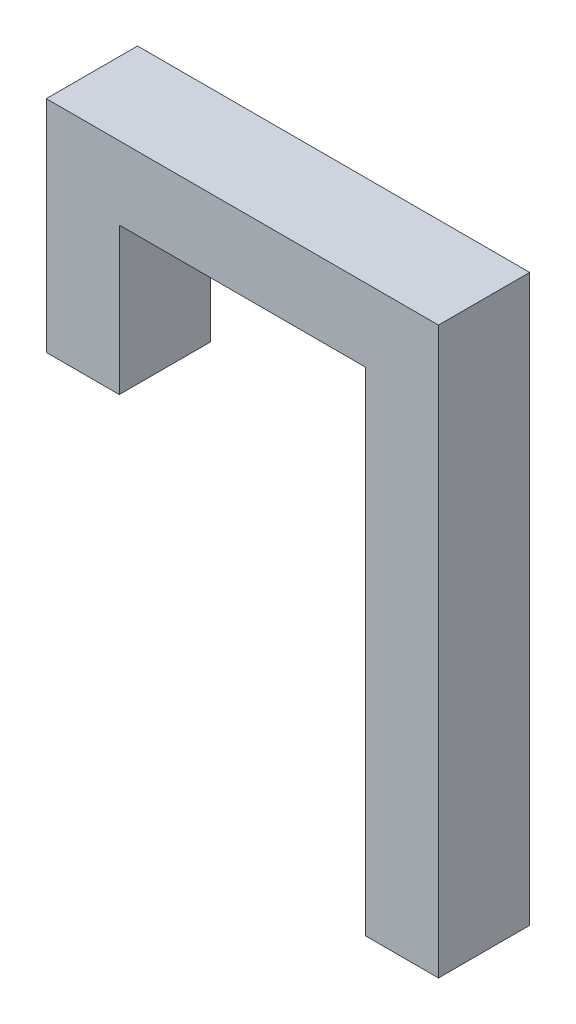
ISO-10303-21;
HEADER;
FILE_DESCRIPTION(('STEP AP214'),'2;1');
FILE_NAME('part.step','',(''),(''),'','','');
FILE_SCHEMA(('AUTOMOTIVE_DESIGN { 1 0 10303 214 1 1 1 1 }'));
ENDSEC;
DATA;
#1=APPLICATION_CONTEXT('core data for automotive mechanical design processes');
#2=APPLICATION_PROTOCOL_DEFINITION('international standard','automotive_design',2000,#1);
#3=PRODUCT_CONTEXT('',#1,'mechanical');
#4=PRODUCT('Part','Part','',(#3));
#5=PRODUCT_RELATED_PRODUCT_CATEGORY('part','',(#4));
#6=PRODUCT_DEFINITION_FORMATION('','',#4);
#7=PRODUCT_DEFINITION_CONTEXT('part definition',#1,'design');
#8=PRODUCT_DEFINITION('design','',#6,#7);
#9=PRODUCT_DEFINITION_SHAPE('','',#8);
#10=(LENGTH_UNIT() NAMED_UNIT(*) SI_UNIT(.MILLI.,.METRE.));
#11=(NAMED_UNIT(*) PLANE_ANGLE_UNIT() SI_UNIT($,.RADIAN.));
#12=(NAMED_UNIT(*) SI_UNIT($,.STERADIAN.) SOLID_ANGLE_UNIT());
#13=UNCERTAINTY_MEASURE_WITH_UNIT(LENGTH_MEASURE(1.E-05),#10,'distance_accuracy_value','');
#14=(GEOMETRIC_REPRESENTATION_CONTEXT(3) GLOBAL_UNCERTAINTY_ASSIGNED_CONTEXT((#13)) GLOBAL_UNIT_ASSIGNED_CONTEXT((#10,
#11,#12)) REPRESENTATION_CONTEXT('',''));
#15=CARTESIAN_POINT('',(0.,0.,0.));
#16=DIRECTION('',(0.,0.,1.));
#17=DIRECTION('',(1.,0.,0.));
#18=AXIS2_PLACEMENT_3D('',#15,#16,#17);
#19=CARTESIAN_POINT('',(0.,0.,5.));
#20=DIRECTION('',(-1.,0.,0.));
#21=DIRECTION('',(0.,0.,1.));
#22=AXIS2_PLACEMENT_3D('',#19,#20,#21);
#23=PLANE('',#22);
#24=DIRECTION('',(0.,1.,0.));
#25=VECTOR('',#24,1.);
#26=CARTESIAN_POINT('',(0.,0.,0.));
#27=LINE('',#26,#25);
#28=CARTESIAN_POINT('',(0.,-8.05,0.));
#29=VERTEX_POINT('',#28);
#30=CARTESIAN_POINT('',(0.,0.,0.));
#31=VERTEX_POINT('',#30);
#32=EDGE_CURVE('E129',#29,#31,#27,.T.);
#33=ORIENTED_EDGE('',*,*,#32,.T.);
#34=DIRECTION('',(0.,0.,-1.));
#35=VECTOR('',#34,1.);
#36=CARTESIAN_POINT('',(0.,0.,5.));
#37=LINE('',#36,#35);
#38=CARTESIAN_POINT('',(0.,0.,5.));
#39=VERTEX_POINT('',#38);
#40=EDGE_CURVE('E11',#39,#31,#37,.T.);
#41=ORIENTED_EDGE('',*,*,#40,.F.);
#42=DIRECTION('',(0.,1.,0.));
#43=VECTOR('',#42,1.);
#44=CARTESIAN_POINT('',(0.,0.,5.));
#45=LINE('',#44,#43);
#46=CARTESIAN_POINT('',(0.,-8.05,5.));
#47=VERTEX_POINT('',#46);
#48=EDGE_CURVE('E143',#47,#39,#45,.T.);
#49=ORIENTED_EDGE('',*,*,#48,.F.);
#50=DIRECTION('',(0.,0.,-1.));
#51=VECTOR('',#50,1.);
#52=CARTESIAN_POINT('',(0.,-8.05,5.));
#53=LINE('',#52,#51);
#54=EDGE_CURVE('E125',#47,#29,#53,.T.);
#55=ORIENTED_EDGE('',*,*,#54,.T.);
#56=EDGE_LOOP('',(#33,#41,#49,#55));
#57=FACE_BOUND('',#56,.T.);
#58=ADVANCED_FACE('F33',(#57),#23,.F.);
#59=CARTESIAN_POINT('',(0.,0.,5.));
#60=DIRECTION('',(0.,1.,0.));
#61=DIRECTION('',(0.,0.,1.));
#62=AXIS2_PLACEMENT_3D('',#59,#60,#61);
#63=PLANE('',#62);
#64=DIRECTION('',(1.,0.,0.));
#65=VECTOR('',#64,1.);
#66=CARTESIAN_POINT('',(0.,0.,0.));
#67=LINE('',#66,#65);
#68=CARTESIAN_POINT('',(13.5,0.,0.));
#69=VERTEX_POINT('',#68);
#70=EDGE_CURVE('E132',#31,#69,#67,.T.);
#71=ORIENTED_EDGE('',*,*,#70,.T.);
#72=DIRECTION('',(0.,0.,-1.));
#73=VECTOR('',#72,1.);
#74=CARTESIAN_POINT('',(13.5,0.,5.));
#75=LINE('',#74,#73);
#76=CARTESIAN_POINT('',(13.5,0.,5.));
#77=VERTEX_POINT('',#76);
#78=EDGE_CURVE('E41',#77,#69,#75,.T.);
#79=ORIENTED_EDGE('',*,*,#78,.F.);
#80=DIRECTION('',(1.,0.,0.));
#81=VECTOR('',#80,1.);
#82=CARTESIAN_POINT('',(0.,0.,5.));
#83=LINE('',#82,#81);
#84=EDGE_CURVE('E92',#39,#77,#83,.T.);
#85=ORIENTED_EDGE('',*,*,#84,.F.);
#86=ORIENTED_EDGE('',*,*,#40,.T.);
#87=EDGE_LOOP('',(#71,#79,#85,#86));
#88=FACE_BOUND('',#87,.T.);
#89=ADVANCED_FACE('F178',(#88),#63,.F.);
#90=CARTESIAN_POINT('',(13.5,0.,5.));
#91=DIRECTION('',(1.,0.,0.));
#92=DIRECTION('',(0.,1.,0.));
#93=AXIS2_PLACEMENT_3D('',#90,#91,#92);
#94=PLANE('',#93);
#95=DIRECTION('',(0.,-1.,0.));
#96=VECTOR('',#95,1.);
#97=CARTESIAN_POINT('',(13.5,0.,0.));
#98=LINE('',#97,#96);
#99=CARTESIAN_POINT('',(13.5,-27.,0.));
#100=VERTEX_POINT('',#99);
#101=EDGE_CURVE('E134',#69,#100,#98,.T.);
#102=ORIENTED_EDGE('',*,*,#101,.T.);
#103=DIRECTION('',(0.,0.,-1.));
#104=VECTOR('',#103,1.);
#105=CARTESIAN_POINT('',(13.5,-27.,5.));
#106=LINE('',#105,#104);
#107=CARTESIAN_POINT('',(13.5,-27.,5.));
#108=VERTEX_POINT('',#107);
#109=EDGE_CURVE('E150',#108,#100,#106,.T.);
#110=ORIENTED_EDGE('',*,*,#109,.F.);
#111=DIRECTION('',(0.,-1.,0.));
#112=VECTOR('',#111,1.);
#113=CARTESIAN_POINT('',(13.5,0.,5.));
#114=LINE('',#113,#112);
#115=EDGE_CURVE('E158',#77,#108,#114,.T.);
#116=ORIENTED_EDGE('',*,*,#115,.F.);
#117=ORIENTED_EDGE('',*,*,#78,.T.);
#118=EDGE_LOOP('',(#102,#110,#116,#117));
#119=FACE_BOUND('',#118,.T.);
#120=ADVANCED_FACE('F156',(#119),#94,.F.);
#121=CARTESIAN_POINT('',(17.5,-27.,5.));
#122=DIRECTION('',(0.,1.,0.));
#123=DIRECTION('',(-1.,0.,0.));
#124=AXIS2_PLACEMENT_3D('',#121,#122,#123);
#125=PLANE('',#124);
#126=DIRECTION('',(1.,0.,0.));
#127=VECTOR('',#126,1.);
#128=CARTESIAN_POINT('',(17.5,-27.,0.));
#129=LINE('',#128,#127);
#130=CARTESIAN_POINT('',(17.5,-27.,0.));
#131=VERTEX_POINT('',#130);
#132=EDGE_CURVE('E136',#100,#131,#129,.T.);
#133=ORIENTED_EDGE('',*,*,#132,.T.);
#134=DIRECTION('',(0.,0.,-1.));
#135=VECTOR('',#134,1.);
#136=CARTESIAN_POINT('',(17.5,-27.,5.));
#137=LINE('',#136,#135);
#138=CARTESIAN_POINT('',(17.5,-27.,5.));
#139=VERTEX_POINT('',#138);
#140=EDGE_CURVE('E147',#139,#131,#137,.T.);
#141=ORIENTED_EDGE('',*,*,#140,.F.);
#142=DIRECTION('',(1.,0.,0.));
#143=VECTOR('',#142,1.);
#144=CARTESIAN_POINT('',(17.5,-27.,5.));
#145=LINE('',#144,#143);
#146=EDGE_CURVE('E170',#108,#139,#145,.T.);
#147=ORIENTED_EDGE('',*,*,#146,.F.);
#148=ORIENTED_EDGE('',*,*,#109,.T.);
#149=EDGE_LOOP('',(#133,#141,#147,#148));
#150=FACE_BOUND('',#149,.T.);
#151=ADVANCED_FACE('F166',(#150),#125,.F.);
#152=CARTESIAN_POINT('',(17.5,4.,5.));
#153=DIRECTION('',(-1.,0.,0.));
#154=DIRECTION('',(0.,-1.,0.));
#155=AXIS2_PLACEMENT_3D('',#152,#153,#154);
#156=PLANE('',#155);
#157=DIRECTION('',(0.,1.,0.));
#158=VECTOR('',#157,1.);
#159=CARTESIAN_POINT('',(17.5,4.,0.));
#160=LINE('',#159,#158);
#161=CARTESIAN_POINT('',(17.5,4.,0.));
#162=VERTEX_POINT('',#161);
#163=EDGE_CURVE('E138',#131,#162,#160,.T.);
#164=ORIENTED_EDGE('',*,*,#163,.T.);
#165=DIRECTION('',(0.,0.,-1.));
#166=VECTOR('',#165,1.);
#167=CARTESIAN_POINT('',(17.5,4.,5.));
#168=LINE('',#167,#166);
#169=CARTESIAN_POINT('',(17.5,4.,5.));
#170=VERTEX_POINT('',#169);
#171=EDGE_CURVE('E120',#170,#162,#168,.T.);
#172=ORIENTED_EDGE('',*,*,#171,.F.);
#173=DIRECTION('',(0.,1.,0.));
#174=VECTOR('',#173,1.);
#175=CARTESIAN_POINT('',(17.5,4.,5.));
#176=LINE('',#175,#174);
#177=EDGE_CURVE('E111',#139,#170,#176,.T.);
#178=ORIENTED_EDGE('',*,*,#177,.F.);
#179=ORIENTED_EDGE('',*,*,#140,.T.);
#180=EDGE_LOOP('',(#164,#172,#178,#179));
#181=FACE_BOUND('',#180,.T.);
#182=ADVANCED_FACE('F169',(#181),#156,.F.);
#183=CARTESIAN_POINT('',(-4.,4.,5.));
#184=DIRECTION('',(0.,-1.,0.));
#185=DIRECTION('',(0.,0.,-1.));
#186=AXIS2_PLACEMENT_3D('',#183,#184,#185);
#187=PLANE('',#186);
#188=DIRECTION('',(-1.,0.,0.));
#189=VECTOR('',#188,1.);
#190=CARTESIAN_POINT('',(-4.,4.,0.));
#191=LINE('',#190,#189);
#192=CARTESIAN_POINT('',(-4.,4.,0.));
#193=VERTEX_POINT('',#192);
#194=EDGE_CURVE('E119',#162,#193,#191,.T.);
#195=ORIENTED_EDGE('',*,*,#194,.T.);
#196=DIRECTION('',(0.,0.,-1.));
#197=VECTOR('',#196,1.);
#198=CARTESIAN_POINT('',(-4.,4.,5.));
#199=LINE('',#198,#197);
#200=CARTESIAN_POINT('',(-4.,4.,5.));
#201=VERTEX_POINT('',#200);
#202=EDGE_CURVE('E116',#201,#193,#199,.T.);
#203=ORIENTED_EDGE('',*,*,#202,.F.);
#204=DIRECTION('',(-1.,0.,0.));
#205=VECTOR('',#204,1.);
#206=CARTESIAN_POINT('',(-4.,4.,5.));
#207=LINE('',#206,#205);
#208=EDGE_CURVE('E105',#170,#201,#207,.T.);
#209=ORIENTED_EDGE('',*,*,#208,.F.);
#210=ORIENTED_EDGE('',*,*,#171,.T.);
#211=EDGE_LOOP('',(#195,#203,#209,#210));
#212=FACE_BOUND('',#211,.T.);
#213=ADVANCED_FACE('F117',(#212),#187,.F.);
#214=CARTESIAN_POINT('',(-4.,-8.05,5.));
#215=DIRECTION('',(1.,0.,0.));
#216=DIRECTION('',(0.,0.,-1.));
#217=AXIS2_PLACEMENT_3D('',#214,#215,#216);
#218=PLANE('',#217);
#219=DIRECTION('',(0.,-1.,0.));
#220=VECTOR('',#219,1.);
#221=CARTESIAN_POINT('',(-4.,-8.05,0.));
#222=LINE('',#221,#220);
#223=CARTESIAN_POINT('',(-4.,-8.05,0.));
#224=VERTEX_POINT('',#223);
#225=EDGE_CURVE('E78',#193,#224,#222,.T.);
#226=ORIENTED_EDGE('',*,*,#225,.T.);
#227=DIRECTION('',(0.,0.,-1.));
#228=VECTOR('',#227,1.);
#229=CARTESIAN_POINT('',(-4.,-8.05,5.));
#230=LINE('',#229,#228);
#231=CARTESIAN_POINT('',(-4.,-8.05,5.));
#232=VERTEX_POINT('',#231);
#233=EDGE_CURVE('E121',#232,#224,#230,.T.);
#234=ORIENTED_EDGE('',*,*,#233,.F.);
#235=DIRECTION('',(0.,-1.,0.));
#236=VECTOR('',#235,1.);
#237=CARTESIAN_POINT('',(-4.,-8.05,5.));
#238=LINE('',#237,#236);
#239=EDGE_CURVE('E109',#201,#232,#238,.T.);
#240=ORIENTED_EDGE('',*,*,#239,.F.);
#241=ORIENTED_EDGE('',*,*,#202,.T.);
#242=EDGE_LOOP('',(#226,#234,#240,#241));
#243=FACE_BOUND('',#242,.T.);
#244=ADVANCED_FACE('F123',(#243),#218,.F.);
#245=CARTESIAN_POINT('',(0.,-8.05,5.));
#246=DIRECTION('',(0.,1.,0.));
#247=DIRECTION('',(0.,0.,1.));
#248=AXIS2_PLACEMENT_3D('',#245,#246,#247);
#249=PLANE('',#248);
#250=DIRECTION('',(1.,0.,0.));
#251=VECTOR('',#250,1.);
#252=CARTESIAN_POINT('',(0.,-8.05,0.));
#253=LINE('',#252,#251);
#254=EDGE_CURVE('E84',#224,#29,#253,.T.);
#255=ORIENTED_EDGE('',*,*,#254,.T.);
#256=ORIENTED_EDGE('',*,*,#54,.F.);
#257=DIRECTION('',(1.,0.,0.));
#258=VECTOR('',#257,1.);
#259=CARTESIAN_POINT('',(0.,-8.05,5.));
#260=LINE('',#259,#258);
#261=EDGE_CURVE('E49',#232,#47,#260,.T.);
#262=ORIENTED_EDGE('',*,*,#261,.F.);
#263=ORIENTED_EDGE('',*,*,#233,.T.);
#264=EDGE_LOOP('',(#255,#256,#262,#263));
#265=FACE_BOUND('',#264,.T.);
#266=ADVANCED_FACE('F194',(#265),#249,.F.);
#267=CARTESIAN_POINT('',(0.,0.,5.));
#268=DIRECTION('',(0.,0.,-1.));
#269=DIRECTION('',(-1.,0.,0.));
#270=AXIS2_PLACEMENT_3D('',#267,#268,#269);
#271=PLANE('',#270);
#272=ORIENTED_EDGE('',*,*,#48,.T.);
#273=ORIENTED_EDGE('',*,*,#84,.T.);
#274=ORIENTED_EDGE('',*,*,#115,.T.);
#275=ORIENTED_EDGE('',*,*,#146,.T.);
#276=ORIENTED_EDGE('',*,*,#177,.T.);
#277=ORIENTED_EDGE('',*,*,#208,.T.);
#278=ORIENTED_EDGE('',*,*,#239,.T.);
#279=ORIENTED_EDGE('',*,*,#261,.T.);
#280=EDGE_LOOP('',(#272,#273,#274,#275,#276,#277,#278,#279));
#281=FACE_BOUND('',#280,.T.);
#282=ADVANCED_FACE('F107',(#281),#271,.F.);
#283=CARTESIAN_POINT('',(0.,0.,0.));
#284=DIRECTION('',(0.,0.,-1.));
#285=DIRECTION('',(-1.,0.,0.));
#286=AXIS2_PLACEMENT_3D('',#283,#284,#285);
#287=PLANE('',#286);
#288=ORIENTED_EDGE('',*,*,#32,.F.);
#289=ORIENTED_EDGE('',*,*,#254,.F.);
#290=ORIENTED_EDGE('',*,*,#225,.F.);
#291=ORIENTED_EDGE('',*,*,#194,.F.);
#292=ORIENTED_EDGE('',*,*,#163,.F.);
#293=ORIENTED_EDGE('',*,*,#132,.F.);
#294=ORIENTED_EDGE('',*,*,#101,.F.);
#295=ORIENTED_EDGE('',*,*,#70,.F.);
#296=EDGE_LOOP('',(#288,#289,#290,#291,#292,#293,#294,#295));
#297=FACE_BOUND('',#296,.T.);
#298=ADVANCED_FACE('F162',(#297),#287,.T.);
#299=CLOSED_SHELL('',(#58,#89,#120,#151,#182,#213,#244,#266,#282,#298));
#300=MANIFOLD_SOLID_BREP('B2',#299);
#301=ADVANCED_BREP_SHAPE_REPRESENTATION('',(#18,#300),#14);
#302=SHAPE_DEFINITION_REPRESENTATION(#9,#301);
ENDSEC;
END-ISO-10303-21;
